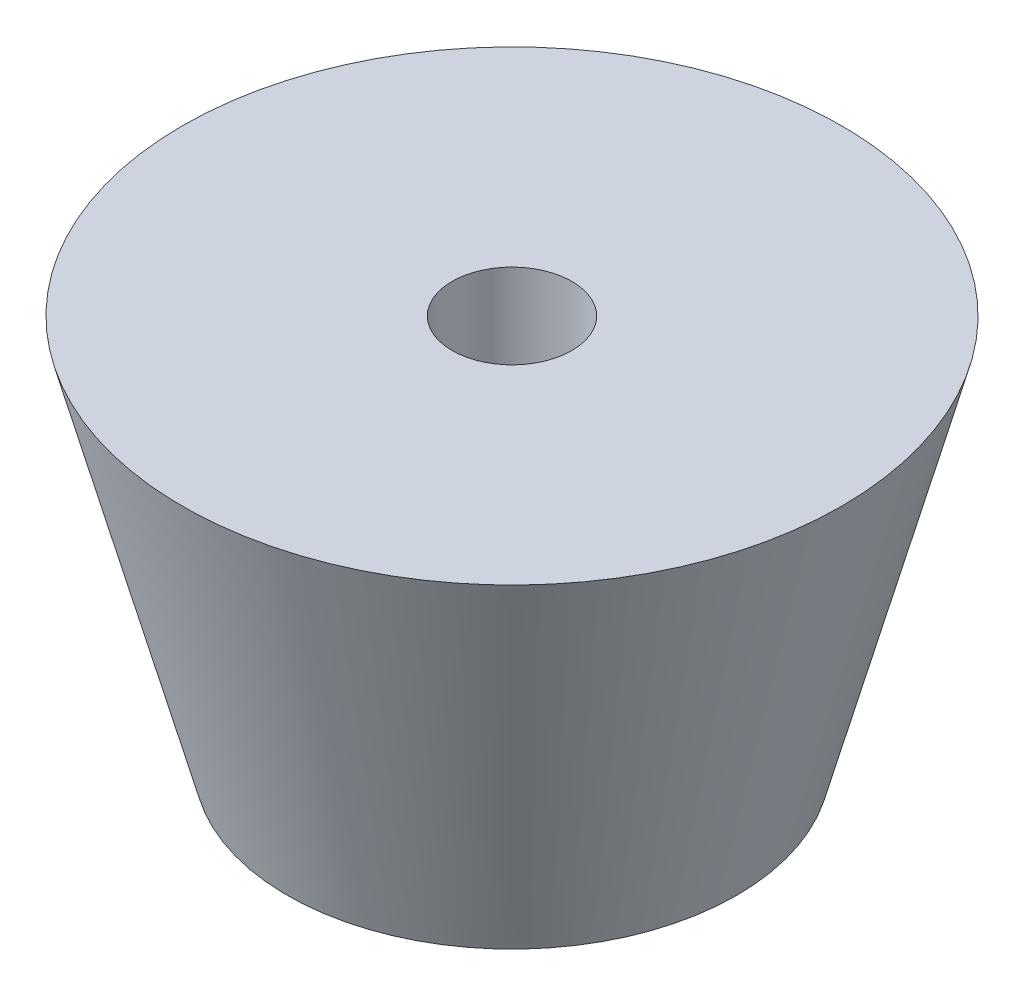
ISO-10303-21;
HEADER;
FILE_DESCRIPTION(('STEP AP214'),'2;1');
FILE_NAME('part.step','',(''),(''),'','','');
FILE_SCHEMA(('AUTOMOTIVE_DESIGN { 1 0 10303 214 1 1 1 1 }'));
ENDSEC;
DATA;
#1=APPLICATION_CONTEXT('core data for automotive mechanical design processes');
#2=APPLICATION_PROTOCOL_DEFINITION('international standard','automotive_design',2000,#1);
#3=PRODUCT_CONTEXT('',#1,'mechanical');
#4=PRODUCT('Part','Part','',(#3));
#5=PRODUCT_RELATED_PRODUCT_CATEGORY('part','',(#4));
#6=PRODUCT_DEFINITION_FORMATION('','',#4);
#7=PRODUCT_DEFINITION_CONTEXT('part definition',#1,'design');
#8=PRODUCT_DEFINITION('design','',#6,#7);
#9=PRODUCT_DEFINITION_SHAPE('','',#8);
#10=(LENGTH_UNIT() NAMED_UNIT(*) SI_UNIT(.MILLI.,.METRE.));
#11=(NAMED_UNIT(*) PLANE_ANGLE_UNIT() SI_UNIT($,.RADIAN.));
#12=(NAMED_UNIT(*) SI_UNIT($,.STERADIAN.) SOLID_ANGLE_UNIT());
#13=UNCERTAINTY_MEASURE_WITH_UNIT(LENGTH_MEASURE(1.E-05),#10,'distance_accuracy_value','');
#14=(GEOMETRIC_REPRESENTATION_CONTEXT(3) GLOBAL_UNCERTAINTY_ASSIGNED_CONTEXT((#13)) GLOBAL_UNIT_ASSIGNED_CONTEXT((#10,
#11,#12)) REPRESENTATION_CONTEXT('',''));
#15=CARTESIAN_POINT('',(0.,0.,0.));
#16=DIRECTION('',(0.,0.,1.));
#17=DIRECTION('',(1.,0.,0.));
#18=AXIS2_PLACEMENT_3D('',#15,#16,#17);
#19=CARTESIAN_POINT('',(0.,0.,0.));
#20=DIRECTION('',(0.,1.,0.));
#21=DIRECTION('',(-1.,0.,0.));
#22=AXIS2_PLACEMENT_3D('',#19,#20,#21);
#23=CONICAL_SURFACE('',#22,11.,0.262994731680916);
#24=CARTESIAN_POINT('',(0.,-13.,0.));
#25=DIRECTION('',(0.,-1.,0.));
#26=DIRECTION('',(1.,0.,0.));
#27=AXIS2_PLACEMENT_3D('',#24,#25,#26);
#28=CIRCLE('',#27,7.50000000000004);
#29=CARTESIAN_POINT('',(7.50000000000009,-13.,0.));
#30=VERTEX_POINT('',#29);
#31=EDGE_CURVE('E63',#30,#30,#28,.T.);
#32=ORIENTED_EDGE('',*,*,#31,.F.);
#33=EDGE_LOOP('',(#32));
#34=FACE_BOUND('',#33,.T.);
#35=CARTESIAN_POINT('',(0.,0.,0.));
#36=DIRECTION('',(0.,-1.,0.));
#37=DIRECTION('',(1.,0.,0.));
#38=AXIS2_PLACEMENT_3D('',#35,#36,#37);
#39=CIRCLE('',#38,11.);
#40=CARTESIAN_POINT('',(11.,0.,0.));
#41=VERTEX_POINT('',#40);
#42=EDGE_CURVE('E10',#41,#41,#39,.T.);
#43=ORIENTED_EDGE('',*,*,#42,.T.);
#44=EDGE_LOOP('',(#43));
#45=FACE_BOUND('',#44,.T.);
#46=ADVANCED_FACE('F41',(#34,#45),#23,.T.);
#47=CARTESIAN_POINT('',(-11.,0.,0.));
#48=DIRECTION('',(0.,-1.,0.));
#49=DIRECTION('',(1.,0.,0.));
#50=AXIS2_PLACEMENT_3D('',#47,#48,#49);
#51=PLANE('',#50);
#52=ORIENTED_EDGE('',*,*,#42,.F.);
#53=EDGE_LOOP('',(#52));
#54=FACE_BOUND('',#53,.T.);
#55=CARTESIAN_POINT('',(0.,0.,0.));
#56=DIRECTION('',(0.,-1.,0.));
#57=DIRECTION('',(1.,0.,0.));
#58=AXIS2_PLACEMENT_3D('',#55,#56,#57);
#59=CIRCLE('',#58,2.);
#60=CARTESIAN_POINT('',(2.,0.,0.));
#61=VERTEX_POINT('',#60);
#62=EDGE_CURVE('E47',#61,#61,#59,.T.);
#63=ORIENTED_EDGE('',*,*,#62,.T.);
#64=EDGE_LOOP('',(#63));
#65=FACE_BOUND('',#64,.T.);
#66=ADVANCED_FACE('F70',(#54,#65),#51,.F.);
#67=CARTESIAN_POINT('',(3.43024899888577E-12,-1000.,0.));
#68=DIRECTION('',(0.,-1.,0.));
#69=DIRECTION('',(1.,0.,0.));
#70=AXIS2_PLACEMENT_3D('',#67,#68,#69);
#71=CYLINDRICAL_SURFACE('',#70,2.00000000000001);
#72=ORIENTED_EDGE('',*,*,#62,.F.);
#73=EDGE_LOOP('',(#72));
#74=FACE_BOUND('',#73,.T.);
#75=CARTESIAN_POINT('',(0.,-6.00000000000001,0.));
#76=DIRECTION('',(0.,-1.,0.));
#77=DIRECTION('',(1.,0.,0.));
#78=AXIS2_PLACEMENT_3D('',#75,#76,#77);
#79=CIRCLE('',#78,2.00000000000002);
#80=CARTESIAN_POINT('',(2.00000000000004,-6.,0.));
#81=VERTEX_POINT('',#80);
#82=EDGE_CURVE('E51',#81,#81,#79,.T.);
#83=ORIENTED_EDGE('',*,*,#82,.T.);
#84=EDGE_LOOP('',(#83));
#85=FACE_BOUND('',#84,.T.);
#86=ADVANCED_FACE('F74',(#74,#85),#71,.F.);
#87=CARTESIAN_POINT('',(-2.,-6.,0.));
#88=DIRECTION('',(0.,1.,0.));
#89=DIRECTION('',(-1.,0.,0.));
#90=AXIS2_PLACEMENT_3D('',#87,#88,#89);
#91=PLANE('',#90);
#92=ORIENTED_EDGE('',*,*,#82,.F.);
#93=EDGE_LOOP('',(#92));
#94=FACE_BOUND('',#93,.T.);
#95=CARTESIAN_POINT('',(0.,-6.00000000000001,0.));
#96=DIRECTION('',(0.,-1.,0.));
#97=DIRECTION('',(1.,0.,0.));
#98=AXIS2_PLACEMENT_3D('',#95,#96,#97);
#99=CIRCLE('',#98,4.00000000000002);
#100=CARTESIAN_POINT('',(4.00000000000004,-5.99999999999999,0.));
#101=VERTEX_POINT('',#100);
#102=EDGE_CURVE('E55',#101,#101,#99,.T.);
#103=ORIENTED_EDGE('',*,*,#102,.T.);
#104=EDGE_LOOP('',(#103));
#105=FACE_BOUND('',#104,.T.);
#106=ADVANCED_FACE('F79',(#94,#105),#91,.F.);
#107=CARTESIAN_POINT('',(3.43024899888577E-12,-1000.,0.));
#108=DIRECTION('',(0.,-1.,0.));
#109=DIRECTION('',(1.,0.,0.));
#110=AXIS2_PLACEMENT_3D('',#107,#108,#109);
#111=CYLINDRICAL_SURFACE('',#110,4.00000000000003);
#112=ORIENTED_EDGE('',*,*,#102,.F.);
#113=EDGE_LOOP('',(#112));
#114=FACE_BOUND('',#113,.T.);
#115=CARTESIAN_POINT('',(0.,-13.,0.));
#116=DIRECTION('',(0.,-1.,0.));
#117=DIRECTION('',(1.,0.,0.));
#118=AXIS2_PLACEMENT_3D('',#115,#116,#117);
#119=CIRCLE('',#118,4.00000000000004);
#120=CARTESIAN_POINT('',(4.00000000000009,-13.,0.));
#121=VERTEX_POINT('',#120);
#122=EDGE_CURVE('E60',#121,#121,#119,.T.);
#123=ORIENTED_EDGE('',*,*,#122,.T.);
#124=EDGE_LOOP('',(#123));
#125=FACE_BOUND('',#124,.T.);
#126=ADVANCED_FACE('F85',(#114,#125),#111,.F.);
#127=CARTESIAN_POINT('',(-4.,-13.,0.));
#128=DIRECTION('',(0.,1.,0.));
#129=DIRECTION('',(-1.,0.,0.));
#130=AXIS2_PLACEMENT_3D('',#127,#128,#129);
#131=PLANE('',#130);
#132=ORIENTED_EDGE('',*,*,#122,.F.);
#133=EDGE_LOOP('',(#132));
#134=FACE_BOUND('',#133,.T.);
#135=ORIENTED_EDGE('',*,*,#31,.T.);
#136=EDGE_LOOP('',(#135));
#137=FACE_BOUND('',#136,.T.);
#138=ADVANCED_FACE('F67',(#134,#137),#131,.F.);
#139=CLOSED_SHELL('',(#46,#66,#86,#106,#126,#138));
#140=MANIFOLD_SOLID_BREP('B2',#139);
#141=ADVANCED_BREP_SHAPE_REPRESENTATION('',(#18,#140),#14);
#142=SHAPE_DEFINITION_REPRESENTATION(#9,#141);
ENDSEC;
END-ISO-10303-21;
